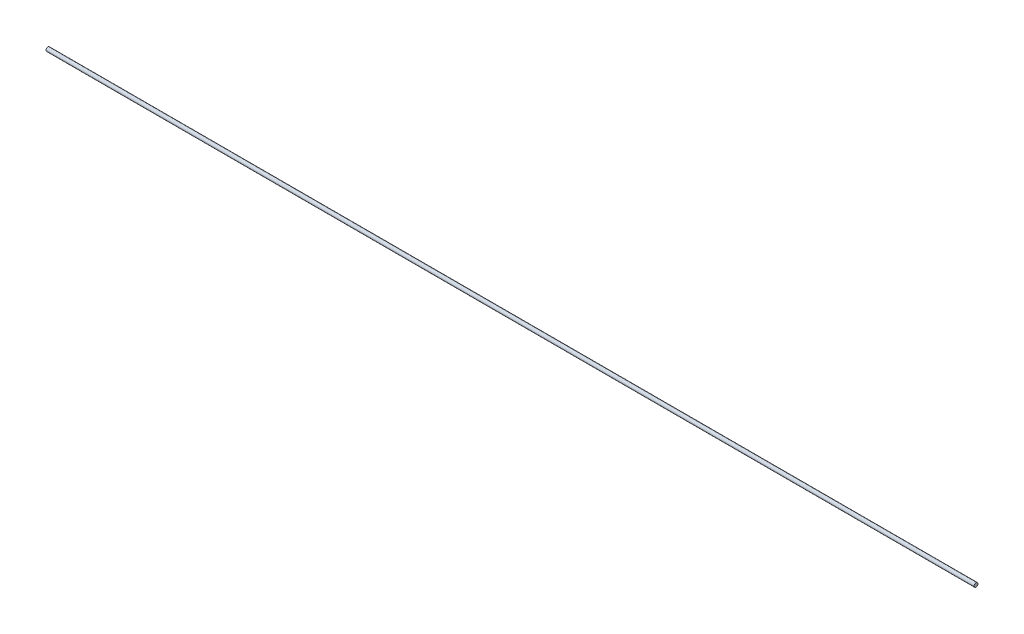
ISO-10303-21;
HEADER;
FILE_DESCRIPTION(('STEP AP214'),'2;1');
FILE_NAME('part.step','',(''),(''),'','','');
FILE_SCHEMA(('AUTOMOTIVE_DESIGN { 1 0 10303 214 1 1 1 1 }'));
ENDSEC;
DATA;
#1=APPLICATION_CONTEXT('core data for automotive mechanical design processes');
#2=APPLICATION_PROTOCOL_DEFINITION('international standard','automotive_design',2000,#1);
#3=PRODUCT_CONTEXT('',#1,'mechanical');
#4=PRODUCT('Part','Part','',(#3));
#5=PRODUCT_RELATED_PRODUCT_CATEGORY('part','',(#4));
#6=PRODUCT_DEFINITION_FORMATION('','',#4);
#7=PRODUCT_DEFINITION_CONTEXT('part definition',#1,'design');
#8=PRODUCT_DEFINITION('design','',#6,#7);
#9=PRODUCT_DEFINITION_SHAPE('','',#8);
#10=(LENGTH_UNIT() NAMED_UNIT(*) SI_UNIT(.MILLI.,.METRE.));
#11=(NAMED_UNIT(*) PLANE_ANGLE_UNIT() SI_UNIT($,.RADIAN.));
#12=(NAMED_UNIT(*) SI_UNIT($,.STERADIAN.) SOLID_ANGLE_UNIT());
#13=UNCERTAINTY_MEASURE_WITH_UNIT(LENGTH_MEASURE(1.E-05),#10,'distance_accuracy_value','');
#14=(GEOMETRIC_REPRESENTATION_CONTEXT(3) GLOBAL_UNCERTAINTY_ASSIGNED_CONTEXT((#13)) GLOBAL_UNIT_ASSIGNED_CONTEXT((#10,
#11,#12)) REPRESENTATION_CONTEXT('',''));
#15=CARTESIAN_POINT('',(0.,0.,0.));
#16=DIRECTION('',(0.,0.,1.));
#17=DIRECTION('',(1.,0.,0.));
#18=AXIS2_PLACEMENT_3D('',#15,#16,#17);
#19=CARTESIAN_POINT('',(1524.,0.,0.));
#20=DIRECTION('',(-1.,0.,0.));
#21=DIRECTION('',(0.,0.,1.));
#22=AXIS2_PLACEMENT_3D('',#19,#20,#21);
#23=CYLINDRICAL_SURFACE('',#22,3.175);
#24=CARTESIAN_POINT('',(1524.,0.,0.));
#25=DIRECTION('',(1.,0.,0.));
#26=DIRECTION('',(0.,0.,-1.));
#27=AXIS2_PLACEMENT_3D('',#24,#25,#26);
#28=CIRCLE('',#27,3.175);
#29=CARTESIAN_POINT('',(1524.,0.,-3.175));
#30=VERTEX_POINT('',#29);
#31=EDGE_CURVE('E10',#30,#30,#28,.T.);
#32=ORIENTED_EDGE('',*,*,#31,.F.);
#33=EDGE_LOOP('',(#32));
#34=FACE_BOUND('',#33,.T.);
#35=CARTESIAN_POINT('',(0.,0.,0.));
#36=DIRECTION('',(1.,0.,0.));
#37=DIRECTION('',(0.,0.,-1.));
#38=AXIS2_PLACEMENT_3D('',#35,#36,#37);
#39=CIRCLE('',#38,3.175);
#40=CARTESIAN_POINT('',(0.,0.,-3.175));
#41=VERTEX_POINT('',#40);
#42=EDGE_CURVE('E35',#41,#41,#39,.T.);
#43=ORIENTED_EDGE('',*,*,#42,.T.);
#44=EDGE_LOOP('',(#43));
#45=FACE_BOUND('',#44,.T.);
#46=ADVANCED_FACE('F32',(#34,#45),#23,.T.);
#47=CARTESIAN_POINT('',(1524.,0.,0.));
#48=DIRECTION('',(1.,0.,0.));
#49=DIRECTION('',(0.,0.,-1.));
#50=AXIS2_PLACEMENT_3D('',#47,#48,#49);
#51=PLANE('',#50);
#52=ORIENTED_EDGE('',*,*,#31,.T.);
#53=EDGE_LOOP('',(#52));
#54=FACE_BOUND('',#53,.T.);
#55=ADVANCED_FACE('F47',(#54),#51,.T.);
#56=CARTESIAN_POINT('',(0.,0.,0.));
#57=DIRECTION('',(1.,0.,0.));
#58=DIRECTION('',(0.,0.,-1.));
#59=AXIS2_PLACEMENT_3D('',#56,#57,#58);
#60=PLANE('',#59);
#61=ORIENTED_EDGE('',*,*,#42,.F.);
#62=EDGE_LOOP('',(#61));
#63=FACE_BOUND('',#62,.T.);
#64=ADVANCED_FACE('F45',(#63),#60,.F.);
#65=CLOSED_SHELL('',(#46,#55,#64));
#66=MANIFOLD_SOLID_BREP('B2',#65);
#67=ADVANCED_BREP_SHAPE_REPRESENTATION('',(#18,#66),#14);
#68=SHAPE_DEFINITION_REPRESENTATION(#9,#67);
ENDSEC;
END-ISO-10303-21;
